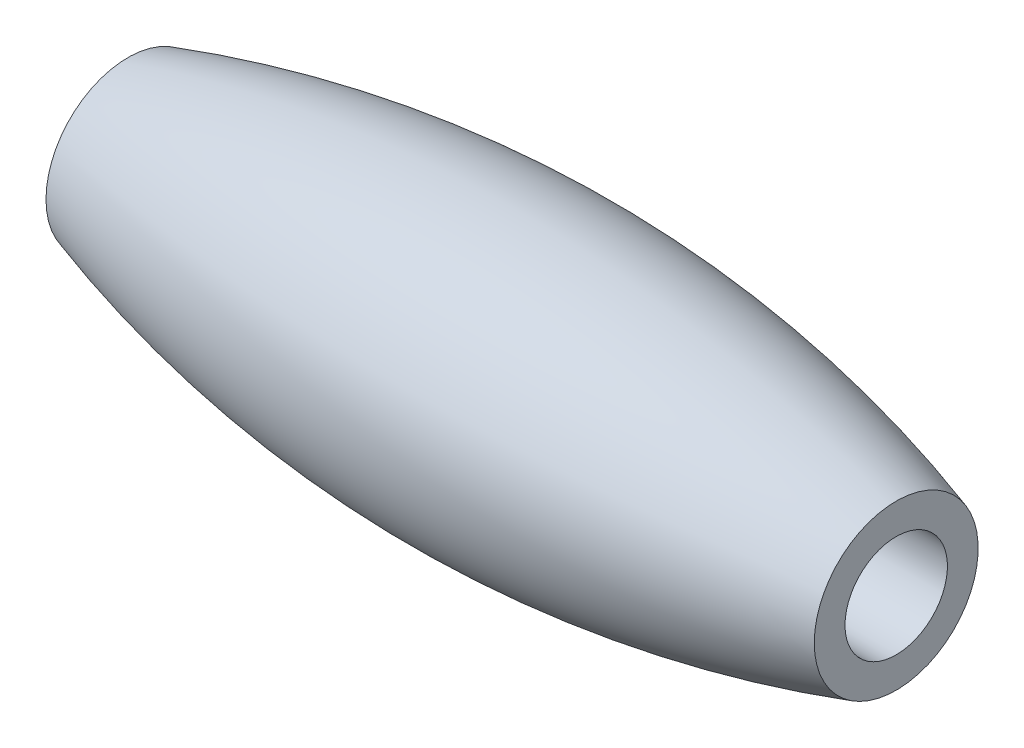
ISO-10303-21;
HEADER;
FILE_DESCRIPTION(('STEP AP214'),'2;1');
FILE_NAME('part.step','',(''),(''),'','','');
FILE_SCHEMA(('AUTOMOTIVE_DESIGN { 1 0 10303 214 1 1 1 1 }'));
ENDSEC;
DATA;
#1=APPLICATION_CONTEXT('core data for automotive mechanical design processes');
#2=APPLICATION_PROTOCOL_DEFINITION('international standard','automotive_design',2000,#1);
#3=PRODUCT_CONTEXT('',#1,'mechanical');
#4=PRODUCT('Part','Part','',(#3));
#5=PRODUCT_RELATED_PRODUCT_CATEGORY('part','',(#4));
#6=PRODUCT_DEFINITION_FORMATION('','',#4);
#7=PRODUCT_DEFINITION_CONTEXT('part definition',#1,'design');
#8=PRODUCT_DEFINITION('design','',#6,#7);
#9=PRODUCT_DEFINITION_SHAPE('','',#8);
#10=(LENGTH_UNIT() NAMED_UNIT(*) SI_UNIT(.MILLI.,.METRE.));
#11=(NAMED_UNIT(*) PLANE_ANGLE_UNIT() SI_UNIT($,.RADIAN.));
#12=(NAMED_UNIT(*) SI_UNIT($,.STERADIAN.) SOLID_ANGLE_UNIT());
#13=UNCERTAINTY_MEASURE_WITH_UNIT(LENGTH_MEASURE(1.E-05),#10,'distance_accuracy_value','');
#14=(GEOMETRIC_REPRESENTATION_CONTEXT(3) GLOBAL_UNCERTAINTY_ASSIGNED_CONTEXT((#13)) GLOBAL_UNIT_ASSIGNED_CONTEXT((#10,
#11,#12)) REPRESENTATION_CONTEXT('',''));
#15=CARTESIAN_POINT('',(0.,0.,0.));
#16=DIRECTION('',(0.,0.,1.));
#17=DIRECTION('',(1.,0.,0.));
#18=AXIS2_PLACEMENT_3D('',#15,#16,#17);
#19=CARTESIAN_POINT('',(-15.,0.,0.));
#20=DIRECTION('',(-1.,0.,0.));
#21=DIRECTION('',(0.,0.,1.));
#22=AXIS2_PLACEMENT_3D('',#19,#20,#21);
#23=CYLINDRICAL_SURFACE('',#22,2.);
#24=CARTESIAN_POINT('',(15.,0.,0.));
#25=DIRECTION('',(-1.,0.,0.));
#26=DIRECTION('',(0.,0.,1.));
#27=AXIS2_PLACEMENT_3D('',#24,#25,#26);
#28=CIRCLE('',#27,2.);
#29=CARTESIAN_POINT('',(15.,0.,2.));
#30=VERTEX_POINT('',#29);
#31=EDGE_CURVE('E10',#30,#30,#28,.T.);
#32=ORIENTED_EDGE('',*,*,#31,.F.);
#33=EDGE_LOOP('',(#32));
#34=FACE_BOUND('',#33,.T.);
#35=CARTESIAN_POINT('',(-15.,0.,0.));
#36=DIRECTION('',(-1.,0.,0.));
#37=DIRECTION('',(0.,0.,1.));
#38=AXIS2_PLACEMENT_3D('',#35,#36,#37);
#39=CIRCLE('',#38,2.);
#40=CARTESIAN_POINT('',(-15.,0.,2.));
#41=VERTEX_POINT('',#40);
#42=EDGE_CURVE('E45',#41,#41,#39,.T.);
#43=ORIENTED_EDGE('',*,*,#42,.T.);
#44=EDGE_LOOP('',(#43));
#45=FACE_BOUND('',#44,.T.);
#46=ADVANCED_FACE('F31',(#34,#45),#23,.F.);
#47=CARTESIAN_POINT('',(15.,2.,0.));
#48=DIRECTION('',(-1.,0.,0.));
#49=DIRECTION('',(0.,0.,1.));
#50=AXIS2_PLACEMENT_3D('',#47,#48,#49);
#51=PLANE('',#50);
#52=CARTESIAN_POINT('',(15.,0.,0.));
#53=DIRECTION('',(-1.,0.,0.));
#54=DIRECTION('',(0.,0.,1.));
#55=AXIS2_PLACEMENT_3D('',#52,#53,#54);
#56=CIRCLE('',#55,3.2);
#57=CARTESIAN_POINT('',(15.,0.,3.2));
#58=VERTEX_POINT('',#57);
#59=EDGE_CURVE('E37',#58,#58,#56,.T.);
#60=ORIENTED_EDGE('',*,*,#59,.F.);
#61=EDGE_LOOP('',(#60));
#62=FACE_BOUND('',#61,.T.);
#63=ORIENTED_EDGE('',*,*,#31,.T.);
#64=EDGE_LOOP('',(#63));
#65=FACE_BOUND('',#64,.T.);
#66=ADVANCED_FACE('F60',(#62,#65),#51,.F.);
#67=CARTESIAN_POINT('',(0.,0.,0.));
#68=DIRECTION('',(-1.,0.,0.));
#69=DIRECTION('',(0.,0.,1.));
#70=AXIS2_PLACEMENT_3D('',#67,#68,#69);
#71=DEGENERATE_TOROIDAL_SURFACE('',#70,44.4969600708473,50.,.F.);
#72=CARTESIAN_POINT('',(-15.,0.,0.));
#73=DIRECTION('',(-1.,0.,0.));
#74=DIRECTION('',(0.,0.,1.));
#75=AXIS2_PLACEMENT_3D('',#72,#73,#74);
#76=CIRCLE('',#75,3.2);
#77=CARTESIAN_POINT('',(-15.,0.,3.2));
#78=VERTEX_POINT('',#77);
#79=EDGE_CURVE('E41',#78,#78,#76,.T.);
#80=ORIENTED_EDGE('',*,*,#79,.F.);
#81=EDGE_LOOP('',(#80));
#82=FACE_BOUND('',#81,.T.);
#83=ORIENTED_EDGE('',*,*,#59,.T.);
#84=EDGE_LOOP('',(#83));
#85=FACE_BOUND('',#84,.T.);
#86=ADVANCED_FACE('F55',(#82,#85),#71,.F.);
#87=CARTESIAN_POINT('',(-15.,3.2,0.));
#88=DIRECTION('',(1.,0.,0.));
#89=DIRECTION('',(0.,0.,-1.));
#90=AXIS2_PLACEMENT_3D('',#87,#88,#89);
#91=PLANE('',#90);
#92=ORIENTED_EDGE('',*,*,#42,.F.);
#93=EDGE_LOOP('',(#92));
#94=FACE_BOUND('',#93,.T.);
#95=ORIENTED_EDGE('',*,*,#79,.T.);
#96=EDGE_LOOP('',(#95));
#97=FACE_BOUND('',#96,.T.);
#98=ADVANCED_FACE('F52',(#94,#97),#91,.F.);
#99=CLOSED_SHELL('',(#46,#66,#86,#98));
#100=MANIFOLD_SOLID_BREP('B2',#99);
#101=ADVANCED_BREP_SHAPE_REPRESENTATION('',(#18,#100),#14);
#102=SHAPE_DEFINITION_REPRESENTATION(#9,#101);
ENDSEC;
END-ISO-10303-21;
